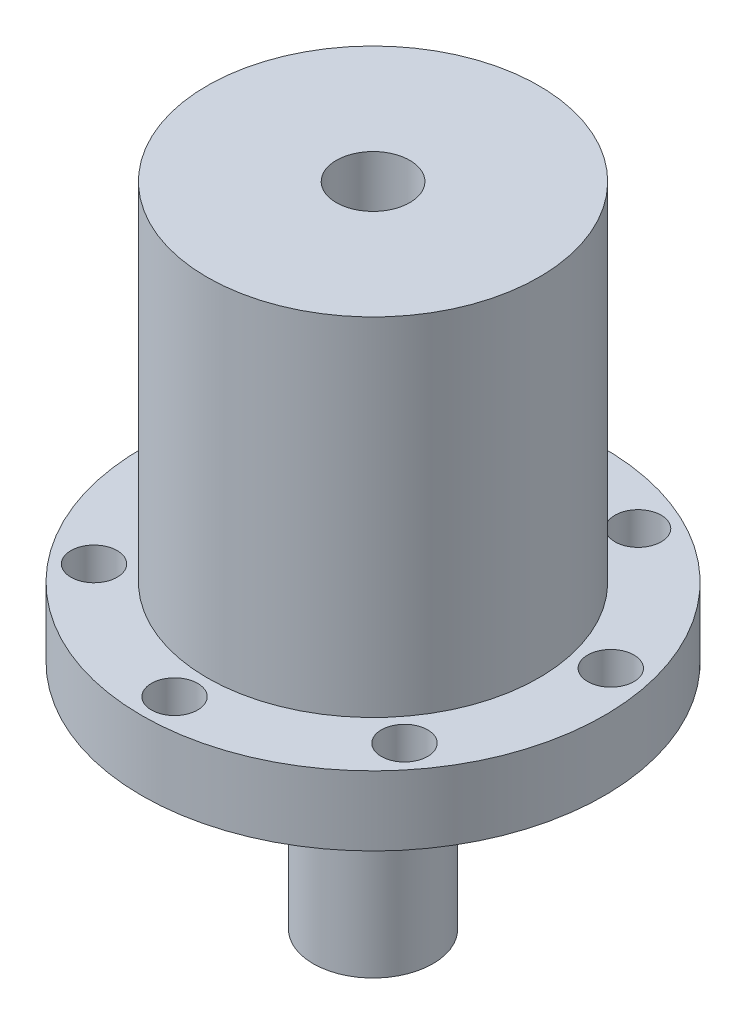
ISO-10303-21;
HEADER;
FILE_DESCRIPTION(('STEP AP214'),'2;1');
FILE_NAME('part.step','',(''),(''),'','','');
FILE_SCHEMA(('AUTOMOTIVE_DESIGN { 1 0 10303 214 1 1 1 1 }'));
ENDSEC;
DATA;
#1=APPLICATION_CONTEXT('core data for automotive mechanical design processes');
#2=APPLICATION_PROTOCOL_DEFINITION('international standard','automotive_design',2000,#1);
#3=PRODUCT_CONTEXT('',#1,'mechanical');
#4=PRODUCT('Part','Part','',(#3));
#5=PRODUCT_RELATED_PRODUCT_CATEGORY('part','',(#4));
#6=PRODUCT_DEFINITION_FORMATION('','',#4);
#7=PRODUCT_DEFINITION_CONTEXT('part definition',#1,'design');
#8=PRODUCT_DEFINITION('design','',#6,#7);
#9=PRODUCT_DEFINITION_SHAPE('','',#8);
#10=(LENGTH_UNIT() NAMED_UNIT(*) SI_UNIT(.MILLI.,.METRE.));
#11=(NAMED_UNIT(*) PLANE_ANGLE_UNIT() SI_UNIT($,.RADIAN.));
#12=(NAMED_UNIT(*) SI_UNIT($,.STERADIAN.) SOLID_ANGLE_UNIT());
#13=UNCERTAINTY_MEASURE_WITH_UNIT(LENGTH_MEASURE(1.E-05),#10,'distance_accuracy_value','');
#14=(GEOMETRIC_REPRESENTATION_CONTEXT(3) GLOBAL_UNCERTAINTY_ASSIGNED_CONTEXT((#13)) GLOBAL_UNIT_ASSIGNED_CONTEXT((#10,
#11,#12)) REPRESENTATION_CONTEXT('',''));
#15=CARTESIAN_POINT('',(0.,0.,0.));
#16=DIRECTION('',(0.,0.,1.));
#17=DIRECTION('',(1.,0.,0.));
#18=AXIS2_PLACEMENT_3D('',#15,#16,#17);
#19=CARTESIAN_POINT('',(0.,-3.,0.));
#20=DIRECTION('',(0.,1.,0.));
#21=DIRECTION('',(0.,0.,1.));
#22=AXIS2_PLACEMENT_3D('',#19,#20,#21);
#23=CYLINDRICAL_SURFACE('',#22,1.5875);
#24=CARTESIAN_POINT('',(0.,8.63415065632549,1.5875));
#25=CARTESIAN_POINT('',(-0.0395765228744761,8.63413147581965,1.58750956703391));
#26=CARTESIAN_POINT('',(-0.0791414603327754,8.63536667564087,1.58602044392211));
#27=CARTESIAN_POINT('',(-0.157863589864403,8.64019906328854,1.5801213133344));
#28=CARTESIAN_POINT('',(-0.19702119812072,8.64379353617797,1.57571466315646));
#29=CARTESIAN_POINT('',(-0.274289674601433,8.65315628257169,1.56410876257414));
#30=CARTESIAN_POINT('',(-0.312406770733406,8.65890483715422,1.5569348274669));
#31=CARTESIAN_POINT('',(-0.387690112288241,8.6723307525074,1.53991669548217));
#32=CARTESIAN_POINT('',(-0.424856123660818,8.68000858311428,1.53007184811132));
#33=CARTESIAN_POINT('',(-0.534268308819786,8.70543822350668,1.49682945845514));
#34=CARTESIAN_POINT('',(-0.604835392267215,8.72564062156371,1.4696609141244));
#35=CARTESIAN_POINT('',(-0.740449380453533,8.77023032625165,1.4062448561955));
#36=CARTESIAN_POINT('',(-0.805481583586271,8.7946282884132,1.36997411516249));
#37=CARTESIAN_POINT('',(-0.937900406216348,8.84888241883566,1.28357956912348));
#38=CARTESIAN_POINT('',(-1.00437447188675,8.87902726728433,1.23223503035379));
#39=CARTESIAN_POINT('',(-1.12851348771735,8.93903543618116,1.11966079116415));
#40=CARTESIAN_POINT('',(-1.18617500422824,8.96889864266199,1.05842725669195));
#41=CARTESIAN_POINT('',(-1.29832010059767,9.02945120993254,0.918444195195142));
#42=CARTESIAN_POINT('',(-1.35148289541241,9.05976869190402,0.83845922137997));
#43=CARTESIAN_POINT('',(-1.44316521683284,9.11351146135875,0.668380842782619));
#44=CARTESIAN_POINT('',(-1.48169861283472,9.13694327201238,0.578297117620739));
#45=CARTESIAN_POINT('',(-1.53868564694888,9.17207069089923,0.400482479966415));
#46=CARTESIAN_POINT('',(-1.55881326816659,9.18473482801484,0.313484574746632));
#47=CARTESIAN_POINT('',(-1.58413290843663,9.20071319485494,0.13653140462551));
#48=CARTESIAN_POINT('',(-1.58934132506166,9.20403768962465,0.0465794965574217));
#49=CARTESIAN_POINT('',(-1.58482705614846,9.20117468304311,-0.120260402448072));
#50=CARTESIAN_POINT('',(-1.57707107649359,9.19623996671573,-0.197233444792849));
#51=CARTESIAN_POINT('',(-1.55067108372348,9.17962601942527,-0.348526556609757));
#52=CARTESIAN_POINT('',(-1.53202620636554,9.16794625311404,-0.422846415004009));
#53=CARTESIAN_POINT('',(-1.48470611121063,9.138819668914,-0.567078404089738));
#54=CARTESIAN_POINT('',(-1.45601922440865,9.12136614311041,-0.636985294798043));
#55=CARTESIAN_POINT('',(-1.38970000110665,9.08202942926241,-0.771030007381741));
#56=CARTESIAN_POINT('',(-1.35206630991214,9.06014557046668,-0.835166953562688));
#57=CARTESIAN_POINT('',(-1.26361183589062,9.01047739019561,-0.964538550696153));
#58=CARTESIAN_POINT('',(-1.2117266025133,8.9822970023242,-1.02889185070457));
#59=CARTESIAN_POINT('',(-1.09896426195195,8.924406558414,-1.148568313076));
#60=CARTESIAN_POINT('',(-1.03807035538961,8.89469371357125,-1.20387418906513));
#61=CARTESIAN_POINT('',(-0.899243064669855,8.83221449566592,-1.31159247001256));
#62=CARTESIAN_POINT('',(-0.820118025774577,8.799590055667,-1.36256127316667));
#63=CARTESIAN_POINT('',(-0.652595946047053,8.73994555707023,-1.4502200902614));
#64=CARTESIAN_POINT('',(-0.564236681312832,8.71290391495587,-1.48696559399687));
#65=CARTESIAN_POINT('',(-0.434860371504752,8.68216898275498,-1.52728203577891));
#66=CARTESIAN_POINT('',(-0.396885113174498,8.67414601690114,-1.53759594015393));
#67=CARTESIAN_POINT('',(-0.319922242874916,8.6601042310211,-1.55543044451846));
#68=CARTESIAN_POINT('',(-0.280935050837347,8.6540845935477,-1.56295218398057));
#69=CARTESIAN_POINT('',(-0.201853753435713,8.6442721280453,-1.57512685726398));
#70=CARTESIAN_POINT('',(-0.161752683461952,8.64050079232005,-1.57975212315708));
#71=CARTESIAN_POINT('',(-0.0811058477622737,8.63542784739645,-1.58594602441984));
#72=CARTESIAN_POINT('',(-0.0405595411914737,8.63412967987148,-1.58751040032115));
#73=CARTESIAN_POINT('',(0.,8.63415065632549,-1.5875));
#74=B_SPLINE_CURVE_WITH_KNOTS('',3,(#24,#25,#26,#27,#28,#29,#30,#31,#32,#33,#34,#35,#36,#37,#38,
#39,#40,#41,#42,#43,#44,#45,#46,#47,#48,#49,#50,#51,#52,#53,#54,#55,#56,#57,#58,#59,#60,#61,#62,
#63,#64,#65,#66,#67,#68,#69,#70,#71,#72,#73),.UNSPECIFIED.,.F.,.F.,(4,2,2,2,2,2,2,2,2,2,2,2,2,2,
2,2,2,2,2,2,2,2,2,2,4),(0.,0.11866358077449,0.237190848100903,0.35465859493571,
0.472154976440276,0.70591796213149,0.940283651994719,1.2069766240342,1.47377324466391,
1.77426045905579,2.07446208101977,2.34338134671552,2.61200493187872,2.84345088794261,
3.07491521617528,3.30664940810054,3.53841871079736,3.79941283846901,4.06089995057356,
4.35834331465186,4.65461426779284,4.77496849121757,4.89527354437296,5.01671092509853,
5.13831717560696),.UNSPECIFIED.);
#75=CARTESIAN_POINT('',(0.,8.63415065632549,1.5875));
#76=VERTEX_POINT('',#75);
#77=CARTESIAN_POINT('',(0.,8.63415065632549,-1.5875));
#78=VERTEX_POINT('',#77);
#79=EDGE_CURVE('E74',#76,#78,#74,.T.);
#80=ORIENTED_EDGE('',*,*,#79,.T.);
#81=DIRECTION('',(0.,1.,0.));
#82=VECTOR('',#81,1.);
#83=CARTESIAN_POINT('',(0.,-3.,-1.5875));
#84=LINE('',#83,#82);
#85=CARTESIAN_POINT('',(0.,4.77158997719047,-1.5875));
#86=VERTEX_POINT('',#85);
#87=EDGE_CURVE('E66',#78,#86,#84,.F.);
#88=ORIENTED_EDGE('',*,*,#87,.T.);
#89=CARTESIAN_POINT('',(0.,4.77158997719047,-1.5875));
#90=CARTESIAN_POINT('',(-0.0395765228744763,4.77160915769631,-1.58750956703391));
#91=CARTESIAN_POINT('',(-0.0791414603327755,4.77037395787509,-1.58602044392211));
#92=CARTESIAN_POINT('',(-0.157863589864403,4.76554157022742,-1.5801213133344));
#93=CARTESIAN_POINT('',(-0.19702119812072,4.76194709733799,-1.57571466315646));
#94=CARTESIAN_POINT('',(-0.274289674601433,4.75258435094427,-1.56410876257414));
#95=CARTESIAN_POINT('',(-0.312406770733406,4.74683579636174,-1.5569348274669));
#96=CARTESIAN_POINT('',(-0.387690112288242,4.73340988100856,-1.53991669548217));
#97=CARTESIAN_POINT('',(-0.424856123660819,4.72573205040168,-1.53007184811132));
#98=CARTESIAN_POINT('',(-0.534268308819786,4.70030241000928,-1.49682945845514));
#99=CARTESIAN_POINT('',(-0.604835392267215,4.68010001195225,-1.4696609141244));
#100=CARTESIAN_POINT('',(-0.740449380453533,4.63551030726431,-1.4062448561955));
#101=CARTESIAN_POINT('',(-0.805481583586271,4.61111234510276,-1.36997411516249));
#102=CARTESIAN_POINT('',(-0.937900406216347,4.5568582146803,-1.28357956912348));
#103=CARTESIAN_POINT('',(-1.00437447188675,4.52671336623164,-1.23223503035379));
#104=CARTESIAN_POINT('',(-1.12851348771735,4.46670519733481,-1.11966079116415));
#105=CARTESIAN_POINT('',(-1.18617500422824,4.43684199085397,-1.05842725669195));
#106=CARTESIAN_POINT('',(-1.29832010059767,4.37628942358343,-0.918444195195142));
#107=CARTESIAN_POINT('',(-1.35148289541241,4.34597194161194,-0.83845922137997));
#108=CARTESIAN_POINT('',(-1.44316521683284,4.29222917215721,-0.668380842782619));
#109=CARTESIAN_POINT('',(-1.48169861283472,4.26879736150358,-0.578297117620739));
#110=CARTESIAN_POINT('',(-1.53868564694888,4.23366994261674,-0.400482479966414));
#111=CARTESIAN_POINT('',(-1.55881326816659,4.22100580550112,-0.313484574746631));
#112=CARTESIAN_POINT('',(-1.58413290843663,4.20502743866102,-0.136531404625509));
#113=CARTESIAN_POINT('',(-1.58934132506166,4.20170294389131,-0.046579496557421));
#114=CARTESIAN_POINT('',(-1.58482705614846,4.20456595047285,0.120260402448073));
#115=CARTESIAN_POINT('',(-1.57707107649359,4.20950066680023,0.19723344479285));
#116=CARTESIAN_POINT('',(-1.55067108372348,4.22611461409069,0.348526556609758));
#117=CARTESIAN_POINT('',(-1.53202620636554,4.23779438040193,0.42284641500401));
#118=CARTESIAN_POINT('',(-1.48470611121063,4.26692096460196,0.567078404089739));
#119=CARTESIAN_POINT('',(-1.45601922440865,4.28437449040555,0.636985294798044));
#120=CARTESIAN_POINT('',(-1.38970000110665,4.32371120425356,0.771030007381742));
#121=CARTESIAN_POINT('',(-1.35206630991214,4.34559506304928,0.835166953562689));
#122=CARTESIAN_POINT('',(-1.26361183589062,4.39526324332035,0.964538550696154));
#123=CARTESIAN_POINT('',(-1.21172660251329,4.42344363119176,1.02889185070457));
#124=CARTESIAN_POINT('',(-1.09896426195195,4.48133407510196,1.148568313076));
#125=CARTESIAN_POINT('',(-1.03807035538961,4.51104691994471,1.20387418906513));
#126=CARTESIAN_POINT('',(-0.899243064669855,4.57352613785004,1.31159247001256));
#127=CARTESIAN_POINT('',(-0.820118025774577,4.60615057784896,1.36256127316667));
#128=CARTESIAN_POINT('',(-0.652595946047052,4.66579507644574,1.4502200902614));
#129=CARTESIAN_POINT('',(-0.564236681312831,4.69283671856009,1.48696559399687));
#130=CARTESIAN_POINT('',(-0.43486037150475,4.72357165076098,1.52728203577891));
#131=CARTESIAN_POINT('',(-0.396885113174496,4.73159461661482,1.53759594015393));
#132=CARTESIAN_POINT('',(-0.319922242874915,4.74563640249486,1.55543044451846));
#133=CARTESIAN_POINT('',(-0.280935050837346,4.75165603996826,1.56295218398057));
#134=CARTESIAN_POINT('',(-0.201853753435712,4.76146850547066,1.57512685726398));
#135=CARTESIAN_POINT('',(-0.161752683461951,4.76523984119591,1.57975212315708));
#136=CARTESIAN_POINT('',(-0.081105847762273,4.77031278611951,1.58594602441984));
#137=CARTESIAN_POINT('',(-0.0405595411914732,4.77161095364448,1.58751040032115));
#138=CARTESIAN_POINT('',(0.,4.77158997719047,1.5875));
#139=B_SPLINE_CURVE_WITH_KNOTS('',3,(#89,#90,#91,#92,#93,#94,#95,#96,#97,#98,#99,#100,#101,#102,
#103,#104,#105,#106,#107,#108,#109,#110,#111,#112,#113,#114,#115,#116,#117,#118,#119,#120,#121,
#122,#123,#124,#125,#126,#127,#128,#129,#130,#131,#132,#133,#134,#135,#136,#137,#138),
.UNSPECIFIED.,.F.,.F.,(4,2,2,2,2,2,2,2,2,2,2,2,2,2,2,2,2,2,2,2,2,2,2,2,4),(0.,0.11866358077449,
0.237190848100903,0.354658594935711,0.472154976440276,0.705917962131491,0.940283651994719,
1.2069766240342,1.47377324466391,1.77426045905579,2.07446208101977,2.34338134671552,
2.61200493187872,2.84345088794261,3.07491521617528,3.30664940810054,3.53841871079736,
3.79941283846901,4.06089995057356,4.35834331465186,4.65461426779284,4.77496849121757,
4.89527354437296,5.01671092509853,5.13831717560696),.UNSPECIFIED.);
#140=CARTESIAN_POINT('',(0.,4.77158997719047,1.5875));
#141=VERTEX_POINT('',#140);
#142=EDGE_CURVE('E58',#86,#141,#139,.T.);
#143=ORIENTED_EDGE('',*,*,#142,.T.);
#144=DIRECTION('',(0.,1.,0.));
#145=VECTOR('',#144,1.);
#146=CARTESIAN_POINT('',(0.,-3.,1.5875));
#147=LINE('',#146,#145);
#148=EDGE_CURVE('E71',#141,#76,#147,.T.);
#149=ORIENTED_EDGE('',*,*,#148,.T.);
#150=EDGE_LOOP('',(#80,#88,#143,#149));
#151=FACE_BOUND('',#150,.T.);
#152=CARTESIAN_POINT('',(0.,15.,0.));
#153=DIRECTION('',(0.,1.,0.));
#154=DIRECTION('',(0.,0.,1.));
#155=AXIS2_PLACEMENT_3D('',#152,#153,#154);
#156=CIRCLE('',#155,1.5875);
#157=CARTESIAN_POINT('',(0.,15.,1.5875));
#158=VERTEX_POINT('',#157);
#159=EDGE_CURVE('E81',#158,#158,#156,.T.);
#160=ORIENTED_EDGE('',*,*,#159,.T.);
#161=EDGE_LOOP('',(#160));
#162=FACE_BOUND('',#161,.T.);
#163=CARTESIAN_POINT('',(0.,-13.,0.));
#164=DIRECTION('',(0.,1.,0.));
#165=DIRECTION('',(0.,0.,1.));
#166=AXIS2_PLACEMENT_3D('',#163,#164,#165);
#167=CIRCLE('',#166,1.5875);
#168=CARTESIAN_POINT('',(0.,-13.,1.5875));
#169=VERTEX_POINT('',#168);
#170=EDGE_CURVE('E284',#169,#169,#167,.T.);
#171=ORIENTED_EDGE('',*,*,#170,.F.);
#172=EDGE_LOOP('',(#171));
#173=FACE_BOUND('',#172,.T.);
#174=ADVANCED_FACE('F37',(#151,#162,#173),#23,.F.);
#175=CARTESIAN_POINT('',(0.,-3.,0.));
#176=DIRECTION('',(0.,1.,0.));
#177=DIRECTION('',(0.,0.,1.));
#178=AXIS2_PLACEMENT_3D('',#175,#176,#177);
#179=CYLINDRICAL_SURFACE('',#178,7.175);
#180=CARTESIAN_POINT('',(0.,0.,0.));
#181=DIRECTION('',(0.,1.,0.));
#182=DIRECTION('',(0.,0.,1.));
#183=AXIS2_PLACEMENT_3D('',#180,#181,#182);
#184=CIRCLE('',#183,7.175);
#185=CARTESIAN_POINT('',(0.,0.,7.175));
#186=VERTEX_POINT('',#185);
#187=EDGE_CURVE('E11',#186,#186,#184,.F.);
#188=ORIENTED_EDGE('',*,*,#187,.F.);
#189=EDGE_LOOP('',(#188));
#190=FACE_BOUND('',#189,.T.);
#191=CARTESIAN_POINT('',(-6.72537173693767,6.70287031675798,-2.5));
#192=CARTESIAN_POINT('',(-6.72537003610282,6.56710225454794,-2.50000202648919));
#193=CARTESIAN_POINT('',(-6.72952780573981,6.43134830637851,-2.48890300789514));
#194=CARTESIAN_POINT('',(-6.74561293814453,6.16388750299437,-2.44496787920928));
#195=CARTESIAN_POINT('',(-6.75754100487008,6.03218101559562,-2.41212979964118));
#196=CARTESIAN_POINT('',(-6.78765511723461,5.77673842365155,-2.32603040366317));
#197=CARTESIAN_POINT('',(-6.80582795785134,5.65298614958953,-2.27281215562501));
#198=CARTESIAN_POINT('',(-6.84636408354557,5.41612281764577,-2.14761231059658));
#199=CARTESIAN_POINT('',(-6.86872842072894,5.30301444221551,-2.07562600086456));
#200=CARTESIAN_POINT('',(-6.91620080295301,5.08580868348843,-1.91163315633861));
#201=CARTESIAN_POINT('',(-6.94138171597869,4.98223262430138,-1.81895705688661));
#202=CARTESIAN_POINT('',(-6.9910369902187,4.79173282197528,-1.61764140537065));
#203=CARTESIAN_POINT('',(-7.01551122507716,4.70481204137412,-1.5089990193838));
#204=CARTESIAN_POINT('',(-7.06184704901954,4.54767429132582,-1.27497191586028));
#205=CARTESIAN_POINT('',(-7.08361305556006,4.47801069466258,-1.14919503134626));
#206=CARTESIAN_POINT('',(-7.1212154250582,4.36104053086508,-0.886817704538822));
#207=CARTESIAN_POINT('',(-7.13705354414782,4.31372734134978,-0.750220482314768));
#208=CARTESIAN_POINT('',(-7.16049911137195,4.24458992583796,-0.475551275421264));
#209=CARTESIAN_POINT('',(-7.16839464362326,4.2218710820921,-0.337729533140436));
#210=CARTESIAN_POINT('',(-7.17609197015598,4.19971503856488,-0.0600188783783323));
#211=CARTESIAN_POINT('',(-7.17589603982129,4.20027129364042,0.0798694419036245));
#212=CARTESIAN_POINT('',(-7.16762358085928,4.22409840184687,0.351382323783596));
#213=CARTESIAN_POINT('',(-7.15988473219807,4.24639596057496,0.483104306455061));
#214=CARTESIAN_POINT('',(-7.13782656494032,4.3114535506212,0.740804050753509));
#215=CARTESIAN_POINT('',(-7.12350679112441,4.35421499748715,0.86678141434779));
#216=CARTESIAN_POINT('',(-7.08948305583168,4.459512939682,1.11145589292729));
#217=CARTESIAN_POINT('',(-7.06970790472453,4.52231275190409,1.23002937877645));
#218=CARTESIAN_POINT('',(-7.02681205098432,4.66568264799424,1.45523134436169));
#219=CARTESIAN_POINT('',(-7.00369036110091,4.74625797944416,1.56185628267318));
#220=CARTESIAN_POINT('',(-6.95512456016094,4.92772277406191,1.76590786462468));
#221=CARTESIAN_POINT('',(-6.92962215056047,5.02944035296797,1.86258528516257));
#222=CARTESIAN_POINT('',(-6.8801481138819,5.24784143473082,2.03776665425079));
#223=CARTESIAN_POINT('',(-6.85617677104106,5.36452770444686,2.11626723539396));
#224=CARTESIAN_POINT('',(-6.81214231682506,5.61212878451539,2.25403658433539));
#225=CARTESIAN_POINT('',(-6.79215183328787,5.74325014634238,2.3129591558208));
#226=CARTESIAN_POINT('',(-6.75918041133304,6.01442930718687,2.40762283868805));
#227=CARTESIAN_POINT('',(-6.74619620574738,6.15448290679279,2.44337475657728));
#228=CARTESIAN_POINT('',(-6.72945758011618,6.43223815007629,2.48909481935132));
#229=CARTESIAN_POINT('',(-6.72528403301702,6.56972155893775,2.50023504829665));
#230=CARTESIAN_POINT('',(-6.72546219514936,6.84462720231824,2.4997575420634));
#231=CARTESIAN_POINT('',(-6.7298121658924,6.98204944359502,2.48814444773747));
#232=CARTESIAN_POINT('',(-6.74612652902743,7.24737083596503,2.44354684196521));
#233=CARTESIAN_POINT('',(-6.75778940461526,7.37543266916635,2.41140770404771));
#234=CARTESIAN_POINT('',(-6.78707461781309,7.62430964967361,2.32770177245626));
#235=CARTESIAN_POINT('',(-6.80469807183626,7.74512343442926,2.27613133910448));
#236=CARTESIAN_POINT('',(-6.84465631733105,7.98061536697608,2.15304784996136));
#237=CARTESIAN_POINT('',(-6.86713047435168,8.09494706618993,2.08091845227423));
#238=CARTESIAN_POINT('',(-6.91400051666037,8.31030542849863,1.91944760618091));
#239=CARTESIAN_POINT('',(-6.93839701659588,8.41132780827567,1.83010063934274));
#240=CARTESIAN_POINT('',(-6.98793658979856,8.60277701370513,1.63107814298838));
#241=CARTESIAN_POINT('',(-7.01305006797175,8.69235118504312,1.52057246210255));
#242=CARTESIAN_POINT('',(-7.05992328068158,8.85175613963011,1.28547834461842));
#243=CARTESIAN_POINT('',(-7.08168309757628,8.92158740775362,1.16089025398131));
#244=CARTESIAN_POINT('',(-7.11932043245754,9.03893107273789,0.901632361380277));
#245=CARTESIAN_POINT('',(-7.13523117168434,9.08656994302564,0.767024888655728));
#246=CARTESIAN_POINT('',(-7.15951531815735,9.15831081989653,0.49103823495311));
#247=CARTESIAN_POINT('',(-7.16789172854807,9.18242220473912,0.349661775745718));
#248=CARTESIAN_POINT('',(-7.17591614795273,9.20551929369112,0.0719149391291694));
#249=CARTESIAN_POINT('',(-7.17598766570016,9.2057241178468,-0.0643428521055404));
#250=CARTESIAN_POINT('',(-7.16845850026376,9.18405461823344,-0.334861597953388));
#251=CARTESIAN_POINT('',(-7.16085853953127,9.16218237354321,-0.469122739390232));
#252=CARTESIAN_POINT('',(-7.13901006920837,9.09780825268492,-0.72931917602017));
#253=CARTESIAN_POINT('',(-7.12488845833934,9.05569953068616,-0.855363173378159));
#254=CARTESIAN_POINT('',(-7.09145408967555,8.95242042637584,-1.09863390073106));
#255=CARTESIAN_POINT('',(-7.07214036883085,8.89124650745203,-1.21585898979751));
#256=CARTESIAN_POINT('',(-7.02935523146942,8.74883991462139,-1.44315250149153));
#257=CARTESIAN_POINT('',(-7.00575112620282,8.66691848608831,-1.55276403842261));
#258=CARTESIAN_POINT('',(-6.95732373684965,8.48648270099402,-1.75707589462991));
#259=CARTESIAN_POINT('',(-6.93250004797834,8.38796280861736,-1.85177121868928));
#260=CARTESIAN_POINT('',(-6.88312204746028,8.17197066090466,-2.0278038423125));
#261=CARTESIAN_POINT('',(-6.85862728883827,8.05385674157927,-2.10837322797801));
#262=CARTESIAN_POINT('',(-6.81398188755424,7.80499247017515,-2.24849012838019));
#263=CARTESIAN_POINT('',(-6.79383062574379,7.67424392296649,-2.30804064004743));
#264=CARTESIAN_POINT('',(-6.76069327971622,7.4056003281987,-2.40336908431942));
#265=CARTESIAN_POINT('',(-6.74760835308999,7.26783504121884,-2.43947646581035));
#266=CARTESIAN_POINT('',(-6.72995033842344,6.98766339272576,-2.48778562352174));
#267=CARTESIAN_POINT('',(-6.72537352071353,6.84525909267033,-2.4999978746893));
#268=CARTESIAN_POINT('',(-6.72537173693767,6.70287031675798,-2.5));
#269=B_SPLINE_CURVE_WITH_KNOTS('',3,(#191,#192,#193,#194,#195,#196,#197,#198,#199,#200,#201,
#202,#203,#204,#205,#206,#207,#208,#209,#210,#211,#212,#213,#214,#215,#216,#217,#218,#219,#220,
#221,#222,#223,#224,#225,#226,#227,#228,#229,#230,#231,#232,#233,#234,#235,#236,#237,#238,#239,
#240,#241,#242,#243,#244,#245,#246,#247,#248,#249,#250,#251,#252,#253,#254,#255,#256,#257,#258,
#259,#260,#261,#262,#263,#264,#265,#266,#267,#268),.UNSPECIFIED.,.T.,.F.,(4,2,2,2,2,2,2,2,2,2,2,
2,2,2,2,2,2,2,2,2,2,2,2,2,2,2,2,2,2,2,2,2,2,2,2,2,2,2,4),(0.,0.406775864753341,
0.813588586898035,1.21954631461488,1.6256060784232,2.04745335376949,2.46937559518487,
2.90345322860311,3.33740216488766,3.7549728228958,4.17242605750002,4.57201063142671,
4.97162284979905,5.37671887725378,5.78193465513694,6.20787248569442,6.63388916167493,
7.06708134001107,7.50007133718363,7.91195128949433,8.32374724197965,8.71958992265505,
9.11550678555007,9.52483445215987,9.93429353193111,10.365594367262,10.7968846091692,
11.2256859369928,11.6543162709858,12.0610784389818,12.4678023042614,12.8669255239904,
13.2661228255705,13.6808759944795,14.0957677640834,14.5288541125431,14.9618786853562,
15.3886780663547,15.8152903086603),.UNSPECIFIED.);
#270=CARTESIAN_POINT('',(-6.72537173693767,6.70287031675798,-2.5));
#271=VERTEX_POINT('',#270);
#272=EDGE_CURVE('E79',#271,#271,#269,.T.);
#273=ORIENTED_EDGE('',*,*,#272,.F.);
#274=EDGE_LOOP('',(#273));
#275=FACE_BOUND('',#274,.T.);
#276=CARTESIAN_POINT('',(0.,15.,0.));
#277=DIRECTION('',(0.,1.,0.));
#278=DIRECTION('',(0.,0.,1.));
#279=AXIS2_PLACEMENT_3D('',#276,#277,#278);
#280=CIRCLE('',#279,7.175);
#281=CARTESIAN_POINT('',(0.,15.,7.175));
#282=VERTEX_POINT('',#281);
#283=EDGE_CURVE('E110',#282,#282,#280,.T.);
#284=ORIENTED_EDGE('',*,*,#283,.F.);
#285=EDGE_LOOP('',(#284));
#286=FACE_BOUND('',#285,.T.);
#287=ADVANCED_FACE('F111',(#190,#275,#286),#179,.T.);
#288=CARTESIAN_POINT('',(0.,15.,0.));
#289=DIRECTION('',(0.,1.,0.));
#290=DIRECTION('',(0.,0.,1.));
#291=AXIS2_PLACEMENT_3D('',#288,#289,#290);
#292=PLANE('',#291);
#293=ORIENTED_EDGE('',*,*,#159,.F.);
#294=EDGE_LOOP('',(#293));
#295=FACE_BOUND('',#294,.T.);
#296=ORIENTED_EDGE('',*,*,#283,.T.);
#297=EDGE_LOOP('',(#296));
#298=FACE_BOUND('',#297,.T.);
#299=ADVANCED_FACE('F102',(#295,#298),#292,.T.);
#300=CARTESIAN_POINT('',(0.,6.70287031675798,0.));
#301=DIRECTION('',(1.,0.,0.));
#302=DIRECTION('',(0.,0.,-1.));
#303=AXIS2_PLACEMENT_3D('',#300,#301,#302);
#304=PLANE('',#303);
#305=CARTESIAN_POINT('',(0.,6.70287031675798,0.));
#306=DIRECTION('',(1.,0.,0.));
#307=DIRECTION('',(0.,0.,-1.));
#308=AXIS2_PLACEMENT_3D('',#305,#306,#307);
#309=CIRCLE('',#308,2.5);
#310=EDGE_CURVE('E68',#86,#78,#309,.T.);
#311=ORIENTED_EDGE('',*,*,#310,.F.);
#312=ORIENTED_EDGE('',*,*,#87,.F.);
#313=EDGE_LOOP('',(#311,#312));
#314=FACE_BOUND('',#313,.T.);
#315=ADVANCED_FACE('F67',(#314),#304,.F.);
#316=EDGE_CURVE('E51',#76,#141,#309,.T.);
#317=ORIENTED_EDGE('',*,*,#316,.F.);
#318=ORIENTED_EDGE('',*,*,#148,.F.);
#319=EDGE_LOOP('',(#317,#318));
#320=FACE_BOUND('',#319,.T.);
#321=ADVANCED_FACE('F99',(#320),#304,.F.);
#322=CARTESIAN_POINT('',(-15.,6.70287031675798,0.));
#323=DIRECTION('',(1.,0.,0.));
#324=DIRECTION('',(0.,0.,-1.));
#325=AXIS2_PLACEMENT_3D('',#322,#323,#324);
#326=CYLINDRICAL_SURFACE('',#325,2.5);
#327=ORIENTED_EDGE('',*,*,#272,.T.);
#328=EDGE_LOOP('',(#327));
#329=FACE_BOUND('',#328,.T.);
#330=ORIENTED_EDGE('',*,*,#310,.T.);
#331=ORIENTED_EDGE('',*,*,#79,.F.);
#332=ORIENTED_EDGE('',*,*,#316,.T.);
#333=ORIENTED_EDGE('',*,*,#142,.F.);
#334=EDGE_LOOP('',(#330,#331,#332,#333));
#335=FACE_BOUND('',#334,.T.);
#336=ADVANCED_FACE('F73',(#329,#335),#326,.F.);
#337=CARTESIAN_POINT('',(0.,-3.,0.));
#338=DIRECTION('',(0.,1.,0.));
#339=DIRECTION('',(0.,0.,1.));
#340=AXIS2_PLACEMENT_3D('',#337,#338,#339);
#341=CYLINDRICAL_SURFACE('',#340,10.);
#342=CARTESIAN_POINT('',(0.,-3.,0.));
#343=DIRECTION('',(0.,1.,0.));
#344=DIRECTION('',(0.,0.,1.));
#345=AXIS2_PLACEMENT_3D('',#342,#343,#344);
#346=CIRCLE('',#345,10.);
#347=CARTESIAN_POINT('',(0.,-3.,10.));
#348=VERTEX_POINT('',#347);
#349=EDGE_CURVE('E287',#348,#348,#346,.T.);
#350=ORIENTED_EDGE('',*,*,#349,.T.);
#351=EDGE_LOOP('',(#350));
#352=FACE_BOUND('',#351,.T.);
#353=CARTESIAN_POINT('',(0.,0.,0.));
#354=DIRECTION('',(0.,1.,0.));
#355=DIRECTION('',(0.,0.,1.));
#356=AXIS2_PLACEMENT_3D('',#353,#354,#355);
#357=CIRCLE('',#356,10.);
#358=CARTESIAN_POINT('',(0.,0.,10.));
#359=VERTEX_POINT('',#358);
#360=EDGE_CURVE('E289',#359,#359,#357,.T.);
#361=ORIENTED_EDGE('',*,*,#360,.F.);
#362=EDGE_LOOP('',(#361));
#363=FACE_BOUND('',#362,.T.);
#364=ADVANCED_FACE('F98',(#352,#363),#341,.T.);
#365=CARTESIAN_POINT('',(0.,0.,0.));
#366=DIRECTION('',(0.,1.,0.));
#367=DIRECTION('',(0.,0.,1.));
#368=AXIS2_PLACEMENT_3D('',#365,#366,#367);
#369=PLANE('',#368);
#370=CARTESIAN_POINT('',(0.,0.,8.58493921522907));
#371=DIRECTION('',(0.,1.,0.));
#372=DIRECTION('',(0.,0.,1.));
#373=AXIS2_PLACEMENT_3D('',#370,#371,#372);
#374=CIRCLE('',#373,1.);
#375=CARTESIAN_POINT('',(0.,0.,9.58493921522907));
#376=VERTEX_POINT('',#375);
#377=EDGE_CURVE('E292',#376,#376,#374,.T.);
#378=ORIENTED_EDGE('',*,*,#377,.F.);
#379=EDGE_LOOP('',(#378));
#380=FACE_BOUND('',#379,.T.);
#381=CARTESIAN_POINT('',(6.7119757535407,0.,5.35262205027291));
#382=DIRECTION('',(0.,1.,0.));
#383=DIRECTION('',(0.,0.,1.));
#384=AXIS2_PLACEMENT_3D('',#381,#382,#383);
#385=CIRCLE('',#384,1.);
#386=CARTESIAN_POINT('',(6.7119757535407,0.,6.35262205027291));
#387=VERTEX_POINT('',#386);
#388=EDGE_CURVE('E297',#387,#387,#385,.T.);
#389=ORIENTED_EDGE('',*,*,#388,.F.);
#390=EDGE_LOOP('',(#389));
#391=FACE_BOUND('',#390,.T.);
#392=CARTESIAN_POINT('',(8.36969686531187,0.,-1.91032869213038));
#393=DIRECTION('',(0.,1.,0.));
#394=DIRECTION('',(0.,0.,1.));
#395=AXIS2_PLACEMENT_3D('',#392,#393,#394);
#396=CIRCLE('',#395,1.);
#397=CARTESIAN_POINT('',(8.36969686531187,0.,-0.910328692130374));
#398=VERTEX_POINT('',#397);
#399=EDGE_CURVE('E301',#398,#398,#396,.T.);
#400=ORIENTED_EDGE('',*,*,#399,.F.);
#401=EDGE_LOOP('',(#400));
#402=FACE_BOUND('',#401,.T.);
#403=CARTESIAN_POINT('',(3.72486552680169,0.,-7.73476296575576));
#404=DIRECTION('',(0.,1.,0.));
#405=DIRECTION('',(0.,0.,1.));
#406=AXIS2_PLACEMENT_3D('',#403,#404,#405);
#407=CIRCLE('',#406,1.);
#408=CARTESIAN_POINT('',(3.72486552680169,0.,-6.73476296575576));
#409=VERTEX_POINT('',#408);
#410=EDGE_CURVE('E305',#409,#409,#407,.T.);
#411=ORIENTED_EDGE('',*,*,#410,.F.);
#412=EDGE_LOOP('',(#411));
#413=FACE_BOUND('',#412,.T.);
#414=CARTESIAN_POINT('',(-3.7248655267994,0.,-7.73476296575628));
#415=DIRECTION('',(0.,1.,0.));
#416=DIRECTION('',(0.,0.,1.));
#417=AXIS2_PLACEMENT_3D('',#414,#415,#416);
#418=CIRCLE('',#417,1.);
#419=CARTESIAN_POINT('',(-3.7248655267994,0.,-6.73476296575628));
#420=VERTEX_POINT('',#419);
#421=EDGE_CURVE('E309',#420,#420,#418,.T.);
#422=ORIENTED_EDGE('',*,*,#421,.F.);
#423=EDGE_LOOP('',(#422));
#424=FACE_BOUND('',#423,.T.);
#425=CARTESIAN_POINT('',(-8.36969686531041,0.,-1.91032869213155));
#426=DIRECTION('',(0.,1.,0.));
#427=DIRECTION('',(0.,0.,1.));
#428=AXIS2_PLACEMENT_3D('',#425,#426,#427);
#429=CIRCLE('',#428,1.);
#430=CARTESIAN_POINT('',(-8.36969686531041,0.,-0.910328692131547));
#431=VERTEX_POINT('',#430);
#432=EDGE_CURVE('E313',#431,#431,#429,.T.);
#433=ORIENTED_EDGE('',*,*,#432,.F.);
#434=EDGE_LOOP('',(#433));
#435=FACE_BOUND('',#434,.T.);
#436=CARTESIAN_POINT('',(-6.71197575354024,0.,5.35262205027197));
#437=DIRECTION('',(0.,1.,0.));
#438=DIRECTION('',(0.,0.,1.));
#439=AXIS2_PLACEMENT_3D('',#436,#437,#438);
#440=CIRCLE('',#439,0.999999999999999);
#441=CARTESIAN_POINT('',(-6.71197575354024,0.,6.35262205027197));
#442=VERTEX_POINT('',#441);
#443=EDGE_CURVE('E317',#442,#442,#440,.T.);
#444=ORIENTED_EDGE('',*,*,#443,.F.);
#445=EDGE_LOOP('',(#444));
#446=FACE_BOUND('',#445,.T.);
#447=ORIENTED_EDGE('',*,*,#187,.T.);
#448=EDGE_LOOP('',(#447));
#449=FACE_BOUND('',#448,.T.);
#450=ORIENTED_EDGE('',*,*,#360,.T.);
#451=EDGE_LOOP('',(#450));
#452=FACE_BOUND('',#451,.T.);
#453=ADVANCED_FACE('F160',(#380,#391,#402,#413,#424,#435,#446,#449,#452),#369,.T.);
#454=CARTESIAN_POINT('',(-6.71197575354024,15.,5.35262205027197));
#455=DIRECTION('',(0.,-1.,0.));
#456=DIRECTION('',(0.,0.,-1.));
#457=AXIS2_PLACEMENT_3D('',#454,#455,#456);
#458=CYLINDRICAL_SURFACE('',#457,0.999999999999999);
#459=ORIENTED_EDGE('',*,*,#443,.T.);
#460=EDGE_LOOP('',(#459));
#461=FACE_BOUND('',#460,.T.);
#462=CARTESIAN_POINT('',(-6.71197575354024,-3.,5.35262205027197));
#463=DIRECTION('',(0.,1.,0.));
#464=DIRECTION('',(0.,0.,1.));
#465=AXIS2_PLACEMENT_3D('',#462,#463,#464);
#466=CIRCLE('',#465,0.999999999999999);
#467=CARTESIAN_POINT('',(-6.71197575354024,-3.,6.35262205027197));
#468=VERTEX_POINT('',#467);
#469=EDGE_CURVE('E316',#468,#468,#466,.T.);
#470=ORIENTED_EDGE('',*,*,#469,.F.);
#471=EDGE_LOOP('',(#470));
#472=FACE_BOUND('',#471,.T.);
#473=ADVANCED_FACE('F168',(#461,#472),#458,.F.);
#474=CARTESIAN_POINT('',(-8.36969686531041,15.,-1.91032869213155));
#475=DIRECTION('',(0.,-1.,0.));
#476=DIRECTION('',(0.,0.,-1.));
#477=AXIS2_PLACEMENT_3D('',#474,#475,#476);
#478=CYLINDRICAL_SURFACE('',#477,1.);
#479=ORIENTED_EDGE('',*,*,#432,.T.);
#480=EDGE_LOOP('',(#479));
#481=FACE_BOUND('',#480,.T.);
#482=CARTESIAN_POINT('',(-8.36969686531041,-3.,-1.91032869213155));
#483=DIRECTION('',(0.,1.,0.));
#484=DIRECTION('',(0.,0.,1.));
#485=AXIS2_PLACEMENT_3D('',#482,#483,#484);
#486=CIRCLE('',#485,1.);
#487=CARTESIAN_POINT('',(-8.36969686531041,-3.,-0.910328692131547));
#488=VERTEX_POINT('',#487);
#489=EDGE_CURVE('E312',#488,#488,#486,.T.);
#490=ORIENTED_EDGE('',*,*,#489,.F.);
#491=EDGE_LOOP('',(#490));
#492=FACE_BOUND('',#491,.T.);
#493=ADVANCED_FACE('F176',(#481,#492),#478,.F.);
#494=CARTESIAN_POINT('',(-3.7248655267994,15.,-7.73476296575628));
#495=DIRECTION('',(0.,-1.,0.));
#496=DIRECTION('',(0.,0.,-1.));
#497=AXIS2_PLACEMENT_3D('',#494,#495,#496);
#498=CYLINDRICAL_SURFACE('',#497,1.);
#499=ORIENTED_EDGE('',*,*,#421,.T.);
#500=EDGE_LOOP('',(#499));
#501=FACE_BOUND('',#500,.T.);
#502=CARTESIAN_POINT('',(-3.7248655267994,-3.,-7.73476296575628));
#503=DIRECTION('',(0.,1.,0.));
#504=DIRECTION('',(0.,0.,1.));
#505=AXIS2_PLACEMENT_3D('',#502,#503,#504);
#506=CIRCLE('',#505,1.);
#507=CARTESIAN_POINT('',(-3.7248655267994,-3.,-6.73476296575628));
#508=VERTEX_POINT('',#507);
#509=EDGE_CURVE('E308',#508,#508,#506,.T.);
#510=ORIENTED_EDGE('',*,*,#509,.F.);
#511=EDGE_LOOP('',(#510));
#512=FACE_BOUND('',#511,.T.);
#513=ADVANCED_FACE('F184',(#501,#512),#498,.F.);
#514=CARTESIAN_POINT('',(3.72486552680169,15.,-7.73476296575576));
#515=DIRECTION('',(0.,-1.,0.));
#516=DIRECTION('',(0.,0.,-1.));
#517=AXIS2_PLACEMENT_3D('',#514,#515,#516);
#518=CYLINDRICAL_SURFACE('',#517,1.);
#519=ORIENTED_EDGE('',*,*,#410,.T.);
#520=EDGE_LOOP('',(#519));
#521=FACE_BOUND('',#520,.T.);
#522=CARTESIAN_POINT('',(3.72486552680169,-3.,-7.73476296575576));
#523=DIRECTION('',(0.,1.,0.));
#524=DIRECTION('',(0.,0.,1.));
#525=AXIS2_PLACEMENT_3D('',#522,#523,#524);
#526=CIRCLE('',#525,1.);
#527=CARTESIAN_POINT('',(3.72486552680169,-3.,-6.73476296575576));
#528=VERTEX_POINT('',#527);
#529=EDGE_CURVE('E304',#528,#528,#526,.T.);
#530=ORIENTED_EDGE('',*,*,#529,.F.);
#531=EDGE_LOOP('',(#530));
#532=FACE_BOUND('',#531,.T.);
#533=ADVANCED_FACE('F192',(#521,#532),#518,.F.);
#534=CARTESIAN_POINT('',(8.36969686531187,15.,-1.91032869213038));
#535=DIRECTION('',(0.,-1.,0.));
#536=DIRECTION('',(0.,0.,-1.));
#537=AXIS2_PLACEMENT_3D('',#534,#535,#536);
#538=CYLINDRICAL_SURFACE('',#537,1.);
#539=ORIENTED_EDGE('',*,*,#399,.T.);
#540=EDGE_LOOP('',(#539));
#541=FACE_BOUND('',#540,.T.);
#542=CARTESIAN_POINT('',(8.36969686531187,-3.,-1.91032869213038));
#543=DIRECTION('',(0.,1.,0.));
#544=DIRECTION('',(0.,0.,1.));
#545=AXIS2_PLACEMENT_3D('',#542,#543,#544);
#546=CIRCLE('',#545,1.);
#547=CARTESIAN_POINT('',(8.36969686531187,-3.,-0.910328692130374));
#548=VERTEX_POINT('',#547);
#549=EDGE_CURVE('E300',#548,#548,#546,.T.);
#550=ORIENTED_EDGE('',*,*,#549,.F.);
#551=EDGE_LOOP('',(#550));
#552=FACE_BOUND('',#551,.T.);
#553=ADVANCED_FACE('F200',(#541,#552),#538,.F.);
#554=CARTESIAN_POINT('',(6.7119757535407,15.,5.35262205027291));
#555=DIRECTION('',(0.,-1.,0.));
#556=DIRECTION('',(0.,0.,-1.));
#557=AXIS2_PLACEMENT_3D('',#554,#555,#556);
#558=CYLINDRICAL_SURFACE('',#557,1.);
#559=ORIENTED_EDGE('',*,*,#388,.T.);
#560=EDGE_LOOP('',(#559));
#561=FACE_BOUND('',#560,.T.);
#562=CARTESIAN_POINT('',(6.7119757535407,-3.,5.35262205027291));
#563=DIRECTION('',(0.,1.,0.));
#564=DIRECTION('',(0.,0.,1.));
#565=AXIS2_PLACEMENT_3D('',#562,#563,#564);
#566=CIRCLE('',#565,1.);
#567=CARTESIAN_POINT('',(6.7119757535407,-3.,6.35262205027291));
#568=VERTEX_POINT('',#567);
#569=EDGE_CURVE('E296',#568,#568,#566,.T.);
#570=ORIENTED_EDGE('',*,*,#569,.F.);
#571=EDGE_LOOP('',(#570));
#572=FACE_BOUND('',#571,.T.);
#573=ADVANCED_FACE('F208',(#561,#572),#558,.F.);
#574=CARTESIAN_POINT('',(0.,15.,8.58493921522907));
#575=DIRECTION('',(0.,-1.,0.));
#576=DIRECTION('',(0.,0.,-1.));
#577=AXIS2_PLACEMENT_3D('',#574,#575,#576);
#578=CYLINDRICAL_SURFACE('',#577,1.);
#579=ORIENTED_EDGE('',*,*,#377,.T.);
#580=EDGE_LOOP('',(#579));
#581=FACE_BOUND('',#580,.T.);
#582=CARTESIAN_POINT('',(0.,-3.,8.58493921522907));
#583=DIRECTION('',(0.,1.,0.));
#584=DIRECTION('',(0.,0.,1.));
#585=AXIS2_PLACEMENT_3D('',#582,#583,#584);
#586=CIRCLE('',#585,1.);
#587=CARTESIAN_POINT('',(0.,-3.,9.58493921522907));
#588=VERTEX_POINT('',#587);
#589=EDGE_CURVE('E295',#588,#588,#586,.T.);
#590=ORIENTED_EDGE('',*,*,#589,.F.);
#591=EDGE_LOOP('',(#590));
#592=FACE_BOUND('',#591,.T.);
#593=ADVANCED_FACE('F216',(#581,#592),#578,.F.);
#594=CARTESIAN_POINT('',(0.,-13.,0.));
#595=DIRECTION('',(0.,-1.,0.));
#596=DIRECTION('',(0.,0.,-1.));
#597=AXIS2_PLACEMENT_3D('',#594,#595,#596);
#598=PLANE('',#597);
#599=ORIENTED_EDGE('',*,*,#170,.T.);
#600=EDGE_LOOP('',(#599));
#601=FACE_BOUND('',#600,.T.);
#602=CARTESIAN_POINT('',(0.,-13.,0.));
#603=DIRECTION('',(0.,-1.,0.));
#604=DIRECTION('',(0.,0.,-1.));
#605=AXIS2_PLACEMENT_3D('',#602,#603,#604);
#606=CIRCLE('',#605,2.5875);
#607=CARTESIAN_POINT('',(0.,-13.,-2.5875));
#608=VERTEX_POINT('',#607);
#609=EDGE_CURVE('E76',#608,#608,#606,.T.);
#610=ORIENTED_EDGE('',*,*,#609,.T.);
#611=EDGE_LOOP('',(#610));
#612=FACE_BOUND('',#611,.T.);
#613=ADVANCED_FACE('F122',(#601,#612),#598,.T.);
#614=CARTESIAN_POINT('',(0.,-13.,0.));
#615=DIRECTION('',(0.,1.,0.));
#616=DIRECTION('',(0.,0.,1.));
#617=AXIS2_PLACEMENT_3D('',#614,#615,#616);
#618=CYLINDRICAL_SURFACE('',#617,2.5875);
#619=ORIENTED_EDGE('',*,*,#609,.F.);
#620=EDGE_LOOP('',(#619));
#621=FACE_BOUND('',#620,.T.);
#622=CARTESIAN_POINT('',(0.,-3.,0.));
#623=DIRECTION('',(0.,1.,0.));
#624=DIRECTION('',(0.,0.,1.));
#625=AXIS2_PLACEMENT_3D('',#622,#623,#624);
#626=CIRCLE('',#625,2.5875);
#627=CARTESIAN_POINT('',(0.,-3.,2.5875));
#628=VERTEX_POINT('',#627);
#629=EDGE_CURVE('E45',#628,#628,#626,.F.);
#630=ORIENTED_EDGE('',*,*,#629,.T.);
#631=EDGE_LOOP('',(#630));
#632=FACE_BOUND('',#631,.T.);
#633=ADVANCED_FACE('F117',(#621,#632),#618,.T.);
#634=CARTESIAN_POINT('',(0.,-3.,0.));
#635=DIRECTION('',(0.,1.,0.));
#636=DIRECTION('',(0.,0.,1.));
#637=AXIS2_PLACEMENT_3D('',#634,#635,#636);
#638=PLANE('',#637);
#639=ORIENTED_EDGE('',*,*,#629,.F.);
#640=EDGE_LOOP('',(#639));
#641=FACE_BOUND('',#640,.T.);
#642=ORIENTED_EDGE('',*,*,#589,.T.);
#643=EDGE_LOOP('',(#642));
#644=FACE_BOUND('',#643,.T.);
#645=ORIENTED_EDGE('',*,*,#569,.T.);
#646=EDGE_LOOP('',(#645));
#647=FACE_BOUND('',#646,.T.);
#648=ORIENTED_EDGE('',*,*,#549,.T.);
#649=EDGE_LOOP('',(#648));
#650=FACE_BOUND('',#649,.T.);
#651=ORIENTED_EDGE('',*,*,#529,.T.);
#652=EDGE_LOOP('',(#651));
#653=FACE_BOUND('',#652,.T.);
#654=ORIENTED_EDGE('',*,*,#509,.T.);
#655=EDGE_LOOP('',(#654));
#656=FACE_BOUND('',#655,.T.);
#657=ORIENTED_EDGE('',*,*,#489,.T.);
#658=EDGE_LOOP('',(#657));
#659=FACE_BOUND('',#658,.T.);
#660=ORIENTED_EDGE('',*,*,#469,.T.);
#661=EDGE_LOOP('',(#660));
#662=FACE_BOUND('',#661,.T.);
#663=ORIENTED_EDGE('',*,*,#349,.F.);
#664=EDGE_LOOP('',(#663));
#665=FACE_BOUND('',#664,.T.);
#666=ADVANCED_FACE('F115',(#641,#644,#647,#650,#653,#656,#659,#662,#665),#638,.F.);
#667=CLOSED_SHELL('',(#174,#287,#299,#315,#321,#336,#364,#453,#473,#493,#513,#533,#553,#573,
#593,#613,#633,#666));
#668=MANIFOLD_SOLID_BREP('B2',#667);
#669=ADVANCED_BREP_SHAPE_REPRESENTATION('',(#18,#668),#14);
#670=SHAPE_DEFINITION_REPRESENTATION(#9,#669);
ENDSEC;
END-ISO-10303-21;
